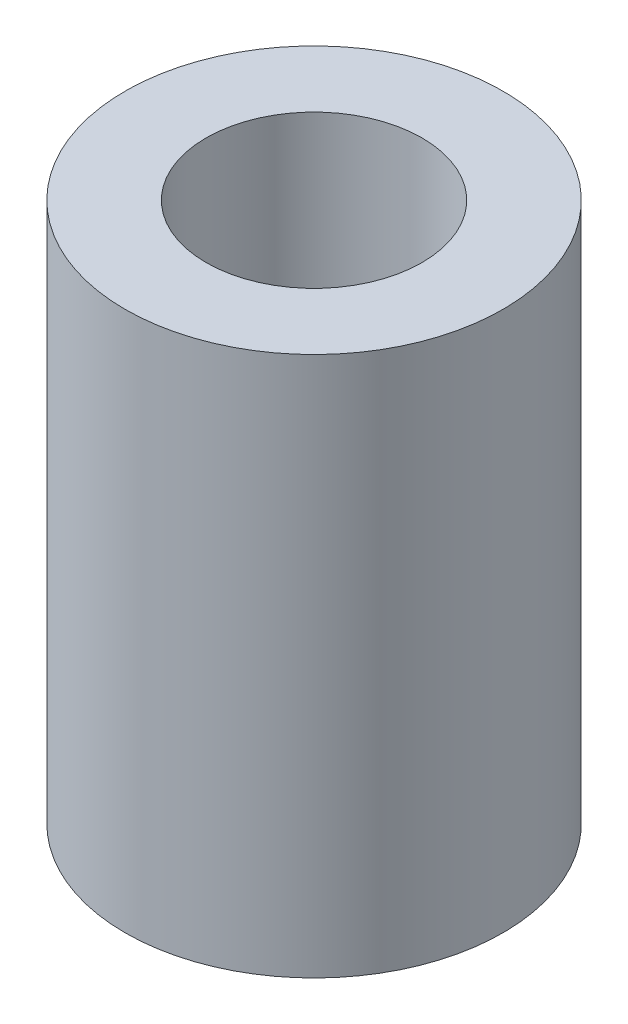
ISO-10303-21;
HEADER;
FILE_DESCRIPTION(('STEP AP214'),'2;1');
FILE_NAME('part.step','',(''),(''),'','','');
FILE_SCHEMA(('AUTOMOTIVE_DESIGN { 1 0 10303 214 1 1 1 1 }'));
ENDSEC;
DATA;
#1=APPLICATION_CONTEXT('core data for automotive mechanical design processes');
#2=APPLICATION_PROTOCOL_DEFINITION('international standard','automotive_design',2000,#1);
#3=PRODUCT_CONTEXT('',#1,'mechanical');
#4=PRODUCT('Part','Part','',(#3));
#5=PRODUCT_RELATED_PRODUCT_CATEGORY('part','',(#4));
#6=PRODUCT_DEFINITION_FORMATION('','',#4);
#7=PRODUCT_DEFINITION_CONTEXT('part definition',#1,'design');
#8=PRODUCT_DEFINITION('design','',#6,#7);
#9=PRODUCT_DEFINITION_SHAPE('','',#8);
#10=(LENGTH_UNIT() NAMED_UNIT(*) SI_UNIT(.MILLI.,.METRE.));
#11=(NAMED_UNIT(*) PLANE_ANGLE_UNIT() SI_UNIT($,.RADIAN.));
#12=(NAMED_UNIT(*) SI_UNIT($,.STERADIAN.) SOLID_ANGLE_UNIT());
#13=UNCERTAINTY_MEASURE_WITH_UNIT(LENGTH_MEASURE(1.E-05),#10,'distance_accuracy_value','');
#14=(GEOMETRIC_REPRESENTATION_CONTEXT(3) GLOBAL_UNCERTAINTY_ASSIGNED_CONTEXT((#13)) GLOBAL_UNIT_ASSIGNED_CONTEXT((#10,
#11,#12)) REPRESENTATION_CONTEXT('',''));
#15=CARTESIAN_POINT('',(0.,0.,0.));
#16=DIRECTION('',(0.,0.,1.));
#17=DIRECTION('',(1.,0.,0.));
#18=AXIS2_PLACEMENT_3D('',#15,#16,#17);
#19=CARTESIAN_POINT('',(0.,31.75,0.));
#20=DIRECTION('',(0.,1.,0.));
#21=DIRECTION('',(0.,0.,1.));
#22=AXIS2_PLACEMENT_3D('',#19,#20,#21);
#23=PLANE('',#22);
#24=CARTESIAN_POINT('',(0.,31.75,0.));
#25=DIRECTION('',(0.,1.,0.));
#26=DIRECTION('',(0.,0.,1.));
#27=AXIS2_PLACEMENT_3D('',#24,#25,#26);
#28=CIRCLE('',#27,11.1125);
#29=CARTESIAN_POINT('',(0.,31.75,11.1125));
#30=VERTEX_POINT('',#29);
#31=EDGE_CURVE('E10',#30,#30,#28,.T.);
#32=ORIENTED_EDGE('',*,*,#31,.T.);
#33=EDGE_LOOP('',(#32));
#34=FACE_BOUND('',#33,.T.);
#35=CARTESIAN_POINT('',(0.,31.75,0.));
#36=DIRECTION('',(0.,1.,0.));
#37=DIRECTION('',(0.,0.,1.));
#38=AXIS2_PLACEMENT_3D('',#35,#36,#37);
#39=CIRCLE('',#38,6.35);
#40=CARTESIAN_POINT('',(0.,31.75,6.35));
#41=VERTEX_POINT('',#40);
#42=EDGE_CURVE('E42',#41,#41,#39,.T.);
#43=ORIENTED_EDGE('',*,*,#42,.F.);
#44=EDGE_LOOP('',(#43));
#45=FACE_BOUND('',#44,.T.);
#46=ADVANCED_FACE('F31',(#34,#45),#23,.T.);
#47=CARTESIAN_POINT('',(0.,0.,0.));
#48=DIRECTION('',(0.,1.,0.));
#49=DIRECTION('',(0.,0.,1.));
#50=AXIS2_PLACEMENT_3D('',#47,#48,#49);
#51=PLANE('',#50);
#52=CARTESIAN_POINT('',(0.,0.,0.));
#53=DIRECTION('',(0.,1.,0.));
#54=DIRECTION('',(0.,0.,1.));
#55=AXIS2_PLACEMENT_3D('',#52,#53,#54);
#56=CIRCLE('',#55,11.1125);
#57=CARTESIAN_POINT('',(0.,0.,11.1125));
#58=VERTEX_POINT('',#57);
#59=EDGE_CURVE('E35',#58,#58,#56,.T.);
#60=ORIENTED_EDGE('',*,*,#59,.F.);
#61=EDGE_LOOP('',(#60));
#62=FACE_BOUND('',#61,.T.);
#63=CARTESIAN_POINT('',(0.,0.,0.));
#64=DIRECTION('',(0.,1.,0.));
#65=DIRECTION('',(0.,0.,1.));
#66=AXIS2_PLACEMENT_3D('',#63,#64,#65);
#67=CIRCLE('',#66,6.35);
#68=CARTESIAN_POINT('',(0.,0.,6.35));
#69=VERTEX_POINT('',#68);
#70=EDGE_CURVE('E44',#69,#69,#67,.T.);
#71=ORIENTED_EDGE('',*,*,#70,.T.);
#72=EDGE_LOOP('',(#71));
#73=FACE_BOUND('',#72,.T.);
#74=ADVANCED_FACE('F54',(#62,#73),#51,.F.);
#75=CARTESIAN_POINT('',(0.,31.75,0.));
#76=DIRECTION('',(0.,-1.,0.));
#77=DIRECTION('',(0.,0.,-1.));
#78=AXIS2_PLACEMENT_3D('',#75,#76,#77);
#79=CYLINDRICAL_SURFACE('',#78,11.1125);
#80=ORIENTED_EDGE('',*,*,#31,.F.);
#81=EDGE_LOOP('',(#80));
#82=FACE_BOUND('',#81,.T.);
#83=ORIENTED_EDGE('',*,*,#59,.T.);
#84=EDGE_LOOP('',(#83));
#85=FACE_BOUND('',#84,.T.);
#86=ADVANCED_FACE('F33',(#82,#85),#79,.T.);
#87=CARTESIAN_POINT('',(0.,31.75,0.));
#88=DIRECTION('',(0.,-1.,0.));
#89=DIRECTION('',(0.,0.,-1.));
#90=AXIS2_PLACEMENT_3D('',#87,#88,#89);
#91=CYLINDRICAL_SURFACE('',#90,6.35);
#92=ORIENTED_EDGE('',*,*,#42,.T.);
#93=EDGE_LOOP('',(#92));
#94=FACE_BOUND('',#93,.T.);
#95=ORIENTED_EDGE('',*,*,#70,.F.);
#96=EDGE_LOOP('',(#95));
#97=FACE_BOUND('',#96,.T.);
#98=ADVANCED_FACE('F50',(#94,#97),#91,.F.);
#99=CLOSED_SHELL('',(#46,#74,#86,#98));
#100=MANIFOLD_SOLID_BREP('B2',#99);
#101=ADVANCED_BREP_SHAPE_REPRESENTATION('',(#18,#100),#14);
#102=SHAPE_DEFINITION_REPRESENTATION(#9,#101);
ENDSEC;
END-ISO-10303-21;
